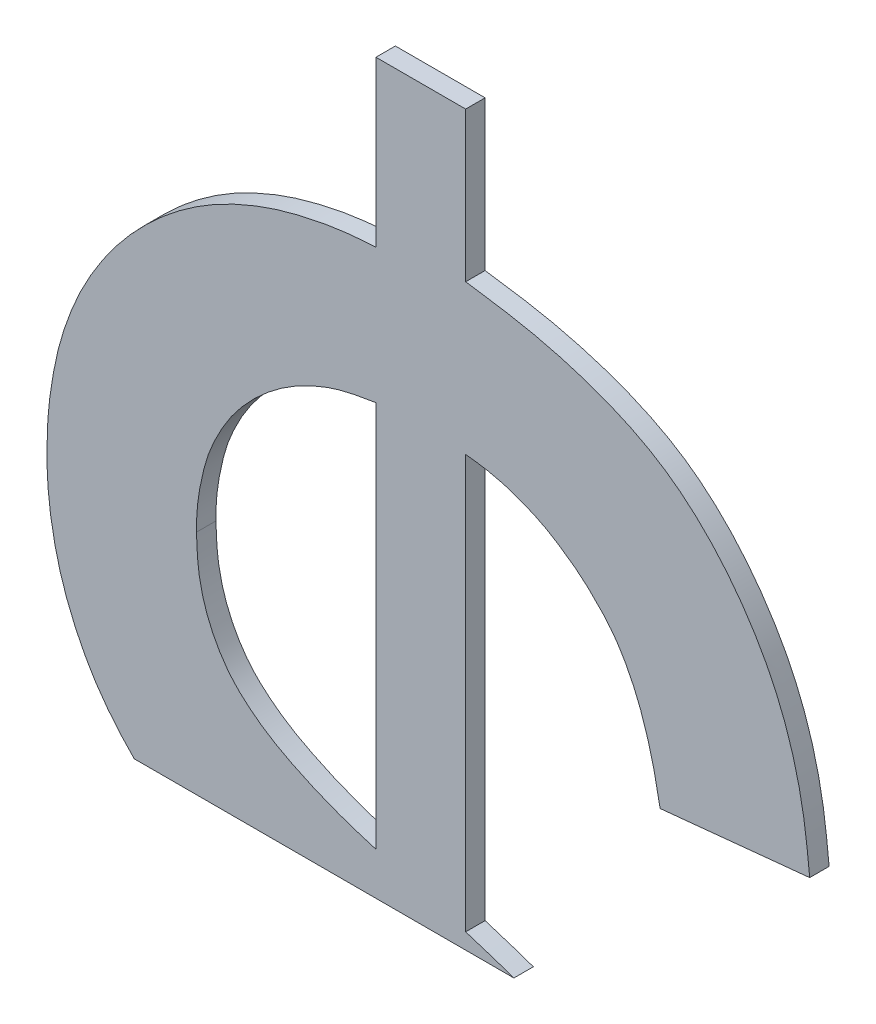
ISO-10303-21;
HEADER;
FILE_DESCRIPTION(('STEP AP214'),'2;1');
FILE_NAME('part.step','',(''),(''),'','','');
FILE_SCHEMA(('AUTOMOTIVE_DESIGN { 1 0 10303 214 1 1 1 1 }'));
ENDSEC;
DATA;
#1=APPLICATION_CONTEXT('core data for automotive mechanical design processes');
#2=APPLICATION_PROTOCOL_DEFINITION('international standard','automotive_design',2000,#1);
#3=PRODUCT_CONTEXT('',#1,'mechanical');
#4=PRODUCT('Part','Part','',(#3));
#5=PRODUCT_RELATED_PRODUCT_CATEGORY('part','',(#4));
#6=PRODUCT_DEFINITION_FORMATION('','',#4);
#7=PRODUCT_DEFINITION_CONTEXT('part definition',#1,'design');
#8=PRODUCT_DEFINITION('design','',#6,#7);
#9=PRODUCT_DEFINITION_SHAPE('','',#8);
#10=(LENGTH_UNIT() NAMED_UNIT(*) SI_UNIT(.MILLI.,.METRE.));
#11=(NAMED_UNIT(*) PLANE_ANGLE_UNIT() SI_UNIT($,.RADIAN.));
#12=(NAMED_UNIT(*) SI_UNIT($,.STERADIAN.) SOLID_ANGLE_UNIT());
#13=UNCERTAINTY_MEASURE_WITH_UNIT(LENGTH_MEASURE(1.E-05),#10,'distance_accuracy_value','');
#14=(GEOMETRIC_REPRESENTATION_CONTEXT(3) GLOBAL_UNCERTAINTY_ASSIGNED_CONTEXT((#13)) GLOBAL_UNIT_ASSIGNED_CONTEXT((#10,
#11,#12)) REPRESENTATION_CONTEXT('',''));
#15=CARTESIAN_POINT('',(0.,0.,0.));
#16=DIRECTION('',(0.,0.,1.));
#17=DIRECTION('',(1.,0.,0.));
#18=AXIS2_PLACEMENT_3D('',#15,#16,#17);
#19=CARTESIAN_POINT('',(1.15384615384615,0.907451923076922,0.5));
#20=CARTESIAN_POINT('',(1.53589483561115,0.787459078570648,0.5));
#21=CARTESIAN_POINT('',(2.30950065305638,0.544486999376421,0.5));
#22=CARTESIAN_POINT('',(3.4532438530345,0.0985681934332211,0.5));
#23=CARTESIAN_POINT('',(4.59457231407284,-0.421585353285468,0.5));
#24=CARTESIAN_POINT('',(5.34226271753068,-0.811849527559877,0.5));
#25=CARTESIAN_POINT('',(5.72115384615384,-1.00961538461539,0.5));
#26=B_SPLINE_CURVE_WITH_KNOTS('',3,(#19,#20,#21,#22,#23,#24,#25),.UNSPECIFIED.,.F.,.F.,(4,1,1,1,
4),(0.,0.242058272273776,0.490140907505919,0.741629575422577,1.),.UNSPECIFIED.);
#27=DIRECTION('',(0.,0.,1.));
#28=VECTOR('',#27,1.);
#29=SURFACE_OF_LINEAR_EXTRUSION('',#26,#28);
#30=CARTESIAN_POINT('',(1.15384615384615,0.907451923076922,1.));
#31=CARTESIAN_POINT('',(1.53589483561115,0.787459078570648,1.));
#32=CARTESIAN_POINT('',(2.30950065305638,0.544486999376421,1.));
#33=CARTESIAN_POINT('',(3.4532438530345,0.0985681934332211,1.));
#34=CARTESIAN_POINT('',(4.59457231407284,-0.421585353285468,1.));
#35=CARTESIAN_POINT('',(5.34226271753068,-0.811849527559877,1.));
#36=CARTESIAN_POINT('',(5.72115384615384,-1.00961538461539,1.));
#37=B_SPLINE_CURVE_WITH_KNOTS('',3,(#30,#31,#32,#33,#34,#35,#36),.UNSPECIFIED.,.F.,.F.,(4,1,1,1,
4),(0.,0.242058272273776,0.490140907505919,0.741629575422577,1.),.UNSPECIFIED.);
#38=CARTESIAN_POINT('',(1.15384615384615,0.907451923076922,1.));
#39=VERTEX_POINT('',#38);
#40=CARTESIAN_POINT('',(2.39404952686093,0.5,1.));
#41=VERTEX_POINT('',#40);
#42=EDGE_CURVE('E43',#39,#41,#37,.T.);
#43=ORIENTED_EDGE('',*,*,#42,.T.);
#44=DIRECTION('',(0.,0.,1.));
#45=VECTOR('',#44,1.);
#46=CARTESIAN_POINT('',(2.3940495441355,0.5,0.5));
#47=LINE('',#46,#45);
#48=CARTESIAN_POINT('',(2.39404952686093,0.5,0.499999999999815));
#49=VERTEX_POINT('',#48);
#50=EDGE_CURVE('E56',#41,#49,#47,.F.);
#51=ORIENTED_EDGE('',*,*,#50,.T.);
#52=CARTESIAN_POINT('',(1.15384615384615,0.907451923076922,0.5));
#53=VERTEX_POINT('',#52);
#54=EDGE_CURVE('E174',#53,#49,#26,.T.);
#55=ORIENTED_EDGE('',*,*,#54,.F.);
#56=DIRECTION('',(0.,0.,1.));
#57=VECTOR('',#56,1.);
#58=CARTESIAN_POINT('',(1.15384615384615,0.907451923076922,0.5));
#59=LINE('',#58,#57);
#60=EDGE_CURVE('E164',#53,#39,#59,.T.);
#61=ORIENTED_EDGE('',*,*,#60,.T.);
#62=EDGE_LOOP('',(#43,#51,#55,#61));
#63=FACE_BOUND('',#62,.T.);
#64=ADVANCED_FACE('F39',(#63),#29,.F.);
#65=CARTESIAN_POINT('',(-4.72355769230769,-1.20793269230769,0.5));
#66=CARTESIAN_POINT('',(-4.99055263360373,-1.08468379020655,0.5));
#67=CARTESIAN_POINT('',(-5.50975341105789,-0.845012860560219,0.5));
#68=CARTESIAN_POINT('',(-6.22622330699287,-0.412378697700305,0.5));
#69=CARTESIAN_POINT('',(-6.87464822067387,0.0476869164056274,0.5));
#70=CARTESIAN_POINT('',(-7.44668441314458,0.556318050159915,0.5));
#71=CARTESIAN_POINT('',(-7.94033959987234,1.11552185514443,0.5));
#72=CARTESIAN_POINT('',(-8.37960139666152,1.71453011685075,0.5));
#73=CARTESIAN_POINT('',(-8.75132379625515,2.36695925351341,0.5));
#74=CARTESIAN_POINT('',(-9.06283405278935,3.06337171504091,0.5));
#75=CARTESIAN_POINT('',(-9.31209001791492,3.79922497951258,0.5));
#76=CARTESIAN_POINT('',(-9.48148633531295,4.56937138693258,0.5));
#77=CARTESIAN_POINT('',(-9.59605696375953,5.36718351148169,0.5));
#78=CARTESIAN_POINT('',(-9.60888025027004,5.90904528303998,0.5));
#79=CARTESIAN_POINT('',(-9.61538461538462,6.18389423076923,0.5));
#80=B_SPLINE_CURVE_WITH_KNOTS('',3,(#65,#66,#67,#68,#69,#70,#71,#72,#73,#74,#75,#76,#77,#78,
#79),.UNSPECIFIED.,.F.,.F.,(4,1,1,1,1,1,1,1,1,1,1,1,4),(0.,0.0933920285341042,0.181610983292623,
0.265535446399889,0.345791528241057,0.424249841898664,0.502182062068234,0.581462596910971,
0.662392562061222,0.744330380200334,0.827884581179354,0.912697768630566,1.),.UNSPECIFIED.);
#81=DIRECTION('',(0.,0.,1.));
#82=VECTOR('',#81,1.);
#83=SURFACE_OF_LINEAR_EXTRUSION('',#80,#82);
#84=CARTESIAN_POINT('',(-7.3681851879955,0.50000000911951,0.5));
#85=VERTEX_POINT('',#84);
#86=CARTESIAN_POINT('',(-9.61538461538462,6.18389423076923,0.5));
#87=VERTEX_POINT('',#86);
#88=EDGE_CURVE('E162',#85,#87,#80,.T.);
#89=ORIENTED_EDGE('',*,*,#88,.F.);
#90=DIRECTION('',(0.,0.,1.));
#91=VECTOR('',#90,1.);
#92=CARTESIAN_POINT('',(-7.36818517862284,0.5,0.5));
#93=LINE('',#92,#91);
#94=CARTESIAN_POINT('',(-7.3681851879955,0.5,1.));
#95=VERTEX_POINT('',#94);
#96=EDGE_CURVE('E143',#85,#95,#93,.T.);
#97=ORIENTED_EDGE('',*,*,#96,.T.);
#98=CARTESIAN_POINT('',(-4.72355769230769,-1.20793269230769,1.));
#99=CARTESIAN_POINT('',(-4.99055263360373,-1.08468379020655,1.));
#100=CARTESIAN_POINT('',(-5.50975341105789,-0.845012860560219,1.));
#101=CARTESIAN_POINT('',(-6.22622330699287,-0.412378697700305,1.));
#102=CARTESIAN_POINT('',(-6.87464822067387,0.0476869164056274,1.));
#103=CARTESIAN_POINT('',(-7.44668441314458,0.556318050159915,1.));
#104=CARTESIAN_POINT('',(-7.94033959987234,1.11552185514443,1.));
#105=CARTESIAN_POINT('',(-8.37960139666152,1.71453011685075,1.));
#106=CARTESIAN_POINT('',(-8.75132379625515,2.36695925351341,1.));
#107=CARTESIAN_POINT('',(-9.06283405278935,3.06337171504091,1.));
#108=CARTESIAN_POINT('',(-9.31209001791492,3.79922497951258,1.));
#109=CARTESIAN_POINT('',(-9.48148633531295,4.56937138693258,1.));
#110=CARTESIAN_POINT('',(-9.59605696375953,5.36718351148169,1.));
#111=CARTESIAN_POINT('',(-9.60888025027004,5.90904528303998,1.));
#112=CARTESIAN_POINT('',(-9.61538461538462,6.18389423076923,1.));
#113=B_SPLINE_CURVE_WITH_KNOTS('',3,(#98,#99,#100,#101,#102,#103,#104,#105,#106,#107,#108,#109,
#110,#111,#112),.UNSPECIFIED.,.F.,.F.,(4,1,1,1,1,1,1,1,1,1,1,1,4),(0.,0.0933920285341042,
0.181610983292623,0.265535446399889,0.345791528241057,0.424249841898664,0.502182062068234,
0.581462596910971,0.662392562061222,0.744330380200334,0.827884581179354,0.912697768630566,1.),.UNSPECIFIED.);
#114=CARTESIAN_POINT('',(-9.61538461538462,6.18389423076923,1.));
#115=VERTEX_POINT('',#114);
#116=EDGE_CURVE('E159',#95,#115,#113,.T.);
#117=ORIENTED_EDGE('',*,*,#116,.T.);
#118=DIRECTION('',(0.,0.,1.));
#119=VECTOR('',#118,1.);
#120=CARTESIAN_POINT('',(-9.61538461538462,6.18389423076923,0.5));
#121=LINE('',#120,#119);
#122=EDGE_CURVE('E399',#87,#115,#121,.T.);
#123=ORIENTED_EDGE('',*,*,#122,.F.);
#124=EDGE_LOOP('',(#89,#97,#117,#123));
#125=FACE_BOUND('',#124,.T.);
#126=ADVANCED_FACE('F160',(#125),#83,.F.);
#127=CARTESIAN_POINT('',(7.41139186249124,12.7931073927375,0.5));
#128=DIRECTION('',(0.,0.,1.));
#129=DIRECTION('',(0.,-1.,0.));
#130=AXIS2_PLACEMENT_3D('',#127,#128,#129);
#131=PLANE('',#130);
#132=CARTESIAN_POINT('',(-5.76923076923077,6.34615384615384,0.5));
#133=CARTESIAN_POINT('',(-5.75932804599917,6.06059324925486,0.5));
#134=CARTESIAN_POINT('',(-5.74033115243513,5.51278794979304,0.5));
#135=CARTESIAN_POINT('',(-5.5499116651548,4.73321644594742,0.5));
#136=CARTESIAN_POINT('',(-5.2342438350835,4.04372300357638,0.5));
#137=CARTESIAN_POINT('',(-4.86857017978813,3.53534728070128,0.5));
#138=CARTESIAN_POINT('',(-4.49662450325635,3.18582118569488,0.5));
#139=CARTESIAN_POINT('',(-4.16939979307783,2.92603971811161,0.5));
#140=CARTESIAN_POINT('',(-3.79286511348281,2.67429430266833,0.5));
#141=CARTESIAN_POINT('',(-3.36112567089013,2.44255506867912,0.5));
#142=CARTESIAN_POINT('',(-2.88436336618781,2.21283090756656,0.5));
#143=CARTESIAN_POINT('',(-2.35537745167494,1.99077937747943,0.5));
#144=CARTESIAN_POINT('',(-1.77327211848351,1.78149018071147,0.5));
#145=CARTESIAN_POINT('',(-1.36475589580147,1.65688139943376,0.5));
#146=CARTESIAN_POINT('',(-1.15384615384616,1.59254807692308,0.5));
#147=B_SPLINE_CURVE_WITH_KNOTS('',3,(#132,#133,#134,#135,#136,#137,#138,#139,#140,#141,#142,
#143,#144,#145,#146),.UNSPECIFIED.,.F.,.F.,(4,1,1,1,1,1,1,1,1,1,1,1,4),(0.,0.118154276653069,
0.226661309744796,0.329907520162531,0.430842471579163,0.483677455027972,0.540972664276143,
0.603818691361891,0.671055171585721,0.743817869451624,0.823052957069743,0.908645353373829,1.),.UNSPECIFIED.);
#148=CARTESIAN_POINT('',(-5.76923076923077,6.34615384615384,0.5));
#149=VERTEX_POINT('',#148);
#150=CARTESIAN_POINT('',(-1.15384615384616,1.59254807692308,0.5));
#151=VERTEX_POINT('',#150);
#152=EDGE_CURVE('E167',#149,#151,#147,.T.);
#153=ORIENTED_EDGE('',*,*,#152,.T.);
#154=DIRECTION('',(0.,1.,0.));
#155=VECTOR('',#154,1.);
#156=CARTESIAN_POINT('',(-1.15384615384616,1.59254807692308,0.5));
#157=LINE('',#156,#155);
#158=CARTESIAN_POINT('',(-1.15384615384616,11.5384615384615,0.5));
#159=VERTEX_POINT('',#158);
#160=EDGE_CURVE('E170',#151,#159,#157,.T.);
#161=ORIENTED_EDGE('',*,*,#160,.T.);
#162=CARTESIAN_POINT('',(-1.15384615384616,11.5384615384615,0.5));
#163=CARTESIAN_POINT('',(-1.4753083425477,11.4861317803194,0.5));
#164=CARTESIAN_POINT('',(-2.10557346527877,11.383533021905,0.5));
#165=CARTESIAN_POINT('',(-2.99155934078027,11.0293207097073,0.5));
#166=CARTESIAN_POINT('',(-3.78953621769737,10.5308144611791,0.5));
#167=CARTESIAN_POINT('',(-4.37005840677036,9.99748361050959,0.5));
#168=CARTESIAN_POINT('',(-4.77698241366401,9.51391347896452,0.5));
#169=CARTESIAN_POINT('',(-5.04175876781717,9.12244174090144,0.5));
#170=CARTESIAN_POINT('',(-5.26341587648575,8.71036265715648,0.5));
#171=CARTESIAN_POINT('',(-5.45519661853269,8.28308982526634,0.5));
#172=CARTESIAN_POINT('',(-5.59021391689391,7.82730967002522,0.5));
#173=CARTESIAN_POINT('',(-5.69106762656066,7.35309163588154,0.5));
#174=CARTESIAN_POINT('',(-5.76278062428456,6.85711385447647,0.5));
#175=CARTESIAN_POINT('',(-5.76705272906671,6.51869127432626,0.5));
#176=CARTESIAN_POINT('',(-5.76923076923077,6.34615384615384,0.5));
#177=B_SPLINE_CURVE_WITH_KNOTS('',3,(#162,#163,#164,#165,#166,#167,#168,#169,#170,#171,#172,
#173,#174,#175,#176),.UNSPECIFIED.,.F.,.F.,(4,1,1,1,1,1,1,1,1,1,1,1,4),(0.,0.127646236634752,
0.250265735213593,0.371898753809236,0.495569504274189,0.55814670152969,0.619921945102661,
0.680849114374849,0.741822015234598,0.803562154960515,0.867160447008884,0.93227462889005,1.),.UNSPECIFIED.);
#178=EDGE_CURVE('E182',#159,#149,#177,.T.);
#179=ORIENTED_EDGE('',*,*,#178,.T.);
#180=EDGE_LOOP('',(#153,#161,#179));
#181=FACE_BOUND('',#180,.T.);
#182=ORIENTED_EDGE('',*,*,#54,.T.);
#183=DIRECTION('',(-1.,0.,0.));
#184=VECTOR('',#183,1.);
#185=CARTESIAN_POINT('',(7.41139186249124,0.5,0.499999999999828));
#186=LINE('',#185,#184);
#187=EDGE_CURVE('E183',#49,#85,#186,.T.);
#188=ORIENTED_EDGE('',*,*,#187,.T.);
#189=ORIENTED_EDGE('',*,*,#88,.T.);
#190=CARTESIAN_POINT('',(-9.61538461538462,6.18389423076923,0.5));
#191=CARTESIAN_POINT('',(-9.60955517472747,6.48682762412066,0.5));
#192=CARTESIAN_POINT('',(-9.5981227716309,7.08092521733586,0.5));
#193=CARTESIAN_POINT('',(-9.47579034685065,7.95046230217413,0.499999999999999));
#194=CARTESIAN_POINT('',(-9.30229914045198,8.78372096506586,0.5));
#195=CARTESIAN_POINT('',(-9.03885026627769,9.57529791808696,0.5));
#196=CARTESIAN_POINT('',(-8.70926808867929,10.332337058475,0.5));
#197=CARTESIAN_POINT('',(-8.29749455743344,11.046234761017,0.5));
#198=CARTESIAN_POINT('',(-7.82001700107709,11.7269795660214,0.5));
#199=CARTESIAN_POINT('',(-7.26838995195899,12.3593215380845,0.5));
#200=CARTESIAN_POINT('',(-6.65954557347659,12.9398464421824,0.5));
#201=CARTESIAN_POINT('',(-6.00140994880213,13.4533425710483,0.5));
#202=CARTESIAN_POINT('',(-5.29980160883602,13.896517603714,0.5));
#203=CARTESIAN_POINT('',(-4.55297699960888,14.2609991086634,0.5));
#204=CARTESIAN_POINT('',(-3.7650372238874,14.5601861634961,0.5));
#205=CARTESIAN_POINT('',(-2.93234770740791,14.7774933403931,0.5));
#206=CARTESIAN_POINT('',(-2.05899968358638,14.9411498002707,0.5));
#207=CARTESIAN_POINT('',(-1.45906006635459,14.9801559634679,0.5));
#208=CARTESIAN_POINT('',(-1.15384615384616,15.,0.5));
#209=B_SPLINE_CURVE_WITH_KNOTS('',3,(#190,#191,#192,#193,#194,#195,#196,#197,#198,#199,#200,
#201,#202,#203,#204,#205,#206,#207,#208),.UNSPECIFIED.,.F.,.F.,(4,1,1,1,1,1,1,1,1,1,1,1,1,1,1,1,
4),(0.,0.0667956946960947,0.130996325684209,0.193417951762092,0.254360414925997,
0.314723074031424,0.375303809955522,0.435884545879619,0.497923155798862,0.560139439289635,
0.621235587589443,0.681816323513541,0.742898080258227,0.804305217370024,0.867456527214562,
0.932569694108617,1.),.UNSPECIFIED.);
#210=CARTESIAN_POINT('',(-1.15384615384616,15.,0.5));
#211=VERTEX_POINT('',#210);
#212=EDGE_CURVE('E231',#87,#211,#209,.T.);
#213=ORIENTED_EDGE('',*,*,#212,.T.);
#214=DIRECTION('',(0.,1.,0.));
#215=VECTOR('',#214,1.);
#216=CARTESIAN_POINT('',(-1.15384615384616,15.,0.5));
#217=LINE('',#216,#215);
#218=CARTESIAN_POINT('',(-1.15384615384616,19.2307692307692,0.5));
#219=VERTEX_POINT('',#218);
#220=EDGE_CURVE('E235',#211,#219,#217,.T.);
#221=ORIENTED_EDGE('',*,*,#220,.T.);
#222=DIRECTION('',(1.,0.,0.));
#223=VECTOR('',#222,1.);
#224=CARTESIAN_POINT('',(-1.15384615384616,19.2307692307692,0.5));
#225=LINE('',#224,#223);
#226=CARTESIAN_POINT('',(1.15384615384615,19.2307692307692,0.5));
#227=VERTEX_POINT('',#226);
#228=EDGE_CURVE('E237',#219,#227,#225,.T.);
#229=ORIENTED_EDGE('',*,*,#228,.T.);
#230=DIRECTION('',(0.,-1.,0.));
#231=VECTOR('',#230,1.);
#232=CARTESIAN_POINT('',(1.15384615384615,19.2307692307692,0.5));
#233=LINE('',#232,#231);
#234=CARTESIAN_POINT('',(1.15384615384615,15.3846153846154,0.5));
#235=VERTEX_POINT('',#234);
#236=EDGE_CURVE('E291',#227,#235,#233,.T.);
#237=ORIENTED_EDGE('',*,*,#236,.T.);
#238=CARTESIAN_POINT('',(1.15384615384615,15.3846153846154,0.5));
#239=CARTESIAN_POINT('',(1.58962502328593,15.322850324043,0.5));
#240=CARTESIAN_POINT('',(2.42245030189539,15.204809943045,0.5));
#241=CARTESIAN_POINT('',(3.60149309312993,14.9354514002694,0.5));
#242=CARTESIAN_POINT('',(4.65215070614306,14.5946429315111,0.5));
#243=CARTESIAN_POINT('',(5.59406936752121,14.1832671756058,0.5));
#244=CARTESIAN_POINT('',(6.44831743485881,13.6692050285473,0.5));
#245=CARTESIAN_POINT('',(7.22068051374382,13.0155873297722,0.5));
#246=CARTESIAN_POINT('',(7.93469071830127,12.2313624307633,0.5));
#247=CARTESIAN_POINT('',(8.58009694369757,11.318559382939,0.5));
#248=CARTESIAN_POINT('',(9.14204263349455,10.2888041178539,0.5));
#249=CARTESIAN_POINT('',(9.56989400136833,9.13572016103952,0.5));
#250=CARTESIAN_POINT('',(9.86415372256355,7.87500939236058,0.5));
#251=CARTESIAN_POINT('',(9.95383535776246,6.99266061312857,0.5));
#252=CARTESIAN_POINT('',(10.,6.53846153846154,0.5));
#253=B_SPLINE_CURVE_WITH_KNOTS('',3,(#238,#239,#240,#241,#242,#243,#244,#245,#246,#247,#248,
#249,#250,#251,#252),.UNSPECIFIED.,.F.,.F.,(4,1,1,1,1,1,1,1,1,1,1,1,4),(0.,0.0955070898349489,
0.182525414330493,0.262140221931509,0.334942378642965,0.405189690581994,0.477731680801076,
0.553750594048482,0.634827900313816,0.719849377267761,0.807637790442588,0.900979363673025,1.),.UNSPECIFIED.);
#254=CARTESIAN_POINT('',(10.,6.53846153846154,0.5));
#255=VERTEX_POINT('',#254);
#256=EDGE_CURVE('E293',#235,#255,#253,.T.);
#257=ORIENTED_EDGE('',*,*,#256,.T.);
#258=DIRECTION('',(-0.995037190209989,-0.0995037190209988,0.));
#259=VECTOR('',#258,1.);
#260=CARTESIAN_POINT('',(10.,6.53846153846154,0.5));
#261=LINE('',#260,#259);
#262=CARTESIAN_POINT('',(6.15384615384615,6.15384615384615,0.5));
#263=VERTEX_POINT('',#262);
#264=EDGE_CURVE('E298',#255,#263,#261,.T.);
#265=ORIENTED_EDGE('',*,*,#264,.T.);
#266=CARTESIAN_POINT('',(6.15384615384615,6.15384615384615,0.5));
#267=CARTESIAN_POINT('',(6.11745649090548,6.35049280694764,0.5));
#268=CARTESIAN_POINT('',(6.04658404020097,6.73348152137632,0.5));
#269=CARTESIAN_POINT('',(5.91617266376332,7.28362623071087,0.5));
#270=CARTESIAN_POINT('',(5.76386970333949,7.79253472381393,0.5));
#271=CARTESIAN_POINT('',(5.599559473583,8.26270205715665,0.5));
#272=CARTESIAN_POINT('',(5.40423860866502,8.69064756795266,0.5));
#273=CARTESIAN_POINT('',(5.19759122246891,9.0806492580052,0.5));
#274=CARTESIAN_POINT('',(4.96772831034702,9.43052061482849,0.5));
#275=CARTESIAN_POINT('',(4.79186696440108,9.63512672690789,0.5));
#276=CARTESIAN_POINT('',(4.70552884615384,9.73557692307693,0.5));
#277=B_SPLINE_CURVE_WITH_KNOTS('',3,(#266,#267,#268,#269,#270,#271,#272,#273,#274,#275,#276),
.UNSPECIFIED.,.F.,.F.,(4,1,1,1,1,1,1,1,4),(0.,0.15329150044996,0.298550286843047,
0.433132698451492,0.560393474398824,0.679983463495146,0.793348119576434,0.898545445606283,1.),.UNSPECIFIED.);
#278=CARTESIAN_POINT('',(4.70552884615384,9.73557692307693,0.5));
#279=VERTEX_POINT('',#278);
#280=EDGE_CURVE('E321',#263,#279,#277,.T.);
#281=ORIENTED_EDGE('',*,*,#280,.T.);
#282=CARTESIAN_POINT('',(4.70552884615384,9.73557692307692,0.5));
#283=CARTESIAN_POINT('',(4.5819349288881,9.8664857604465,0.5));
#284=CARTESIAN_POINT('',(4.33816581664662,10.1246823754266,0.5));
#285=CARTESIAN_POINT('',(3.93383900529747,10.4588769265589,0.5));
#286=CARTESIAN_POINT('',(3.51372648086241,10.7485924867606,0.5));
#287=CARTESIAN_POINT('',(3.08343550687438,11.0083515868184,0.5));
#288=CARTESIAN_POINT('',(2.62210149600414,11.1994549051335,0.5));
#289=CARTESIAN_POINT('',(2.15127724489674,11.3684402779212,0.5));
#290=CARTESIAN_POINT('',(1.65901873526613,11.4823144857725,0.5));
#291=CARTESIAN_POINT('',(1.3225987093175,11.5197056538947,0.5));
#292=CARTESIAN_POINT('',(1.15384615384615,11.5384615384615,0.5));
#293=B_SPLINE_CURVE_WITH_KNOTS('',3,(#282,#283,#284,#285,#286,#287,#288,#289,#290,#291,#292),
.UNSPECIFIED.,.F.,.F.,(4,1,1,1,1,1,1,1,4),(0.,0.132296135514945,0.260932837318478,
0.384755761345875,0.507549119686902,0.629606836866915,0.751201402836805,0.87519946545814,1.),.UNSPECIFIED.);
#294=CARTESIAN_POINT('',(1.15384615384615,11.5384615384615,0.5));
#295=VERTEX_POINT('',#294);
#296=EDGE_CURVE('E324',#279,#295,#293,.T.);
#297=ORIENTED_EDGE('',*,*,#296,.T.);
#298=DIRECTION('',(0.,-1.,0.));
#299=VECTOR('',#298,1.);
#300=CARTESIAN_POINT('',(1.15384615384615,11.5384615384615,0.5));
#301=LINE('',#300,#299);
#302=EDGE_CURVE('E155',#295,#53,#301,.T.);
#303=ORIENTED_EDGE('',*,*,#302,.T.);
#304=EDGE_LOOP('',(#182,#188,#189,#213,#221,#229,#237,#257,#265,#281,#297,#303));
#305=FACE_BOUND('',#304,.T.);
#306=ADVANCED_FACE('F197',(#181,#305),#131,.F.);
#307=CARTESIAN_POINT('',(7.41139186249124,12.7931073927375,1.));
#308=DIRECTION('',(0.,0.,1.));
#309=DIRECTION('',(0.,-1.,0.));
#310=AXIS2_PLACEMENT_3D('',#307,#308,#309);
#311=PLANE('',#310);
#312=DIRECTION('',(0.,1.,0.));
#313=VECTOR('',#312,1.);
#314=CARTESIAN_POINT('',(-1.15384615384616,1.59254807692308,1.));
#315=LINE('',#314,#313);
#316=CARTESIAN_POINT('',(-1.15384615384616,1.59254807692308,1.));
#317=VERTEX_POINT('',#316);
#318=CARTESIAN_POINT('',(-1.15384615384616,11.5384615384615,1.));
#319=VERTEX_POINT('',#318);
#320=EDGE_CURVE('E215',#317,#319,#315,.T.);
#321=ORIENTED_EDGE('',*,*,#320,.F.);
#322=CARTESIAN_POINT('',(-5.76923076923077,6.34615384615384,1.));
#323=CARTESIAN_POINT('',(-5.75932804599917,6.06059324925486,1.));
#324=CARTESIAN_POINT('',(-5.74033115243513,5.51278794979304,1.));
#325=CARTESIAN_POINT('',(-5.5499116651548,4.73321644594742,1.));
#326=CARTESIAN_POINT('',(-5.2342438350835,4.04372300357638,1.));
#327=CARTESIAN_POINT('',(-4.86857017978813,3.53534728070128,1.));
#328=CARTESIAN_POINT('',(-4.49662450325635,3.18582118569488,1.));
#329=CARTESIAN_POINT('',(-4.16939979307783,2.92603971811161,1.));
#330=CARTESIAN_POINT('',(-3.79286511348281,2.67429430266833,1.));
#331=CARTESIAN_POINT('',(-3.36112567089013,2.44255506867912,1.));
#332=CARTESIAN_POINT('',(-2.88436336618781,2.21283090756656,1.));
#333=CARTESIAN_POINT('',(-2.35537745167494,1.99077937747943,1.));
#334=CARTESIAN_POINT('',(-1.77327211848351,1.78149018071147,1.));
#335=CARTESIAN_POINT('',(-1.36475589580147,1.65688139943376,1.));
#336=CARTESIAN_POINT('',(-1.15384615384616,1.59254807692308,1.));
#337=B_SPLINE_CURVE_WITH_KNOTS('',3,(#322,#323,#324,#325,#326,#327,#328,#329,#330,#331,#332,
#333,#334,#335,#336),.UNSPECIFIED.,.F.,.F.,(4,1,1,1,1,1,1,1,1,1,1,1,4),(0.,0.118154276653069,
0.226661309744796,0.329907520162531,0.430842471579163,0.483677455027972,0.540972664276143,
0.603818691361891,0.671055171585721,0.743817869451624,0.823052957069743,0.908645353373829,1.),.UNSPECIFIED.);
#338=CARTESIAN_POINT('',(-5.76923076923077,6.34615384615384,1.));
#339=VERTEX_POINT('',#338);
#340=EDGE_CURVE('E274',#339,#317,#337,.T.);
#341=ORIENTED_EDGE('',*,*,#340,.F.);
#342=CARTESIAN_POINT('',(-1.15384615384616,11.5384615384615,1.));
#343=CARTESIAN_POINT('',(-1.4753083425477,11.4861317803194,1.));
#344=CARTESIAN_POINT('',(-2.10557346527877,11.383533021905,1.));
#345=CARTESIAN_POINT('',(-2.99155934078027,11.0293207097073,1.));
#346=CARTESIAN_POINT('',(-3.78953621769737,10.5308144611791,1.));
#347=CARTESIAN_POINT('',(-4.37005840677036,9.99748361050959,1.));
#348=CARTESIAN_POINT('',(-4.77698241366401,9.51391347896452,1.));
#349=CARTESIAN_POINT('',(-5.04175876781717,9.12244174090144,1.));
#350=CARTESIAN_POINT('',(-5.26341587648575,8.71036265715648,1.));
#351=CARTESIAN_POINT('',(-5.45519661853269,8.28308982526634,1.));
#352=CARTESIAN_POINT('',(-5.59021391689391,7.82730967002522,1.));
#353=CARTESIAN_POINT('',(-5.69106762656066,7.35309163588154,1.));
#354=CARTESIAN_POINT('',(-5.76278062428456,6.85711385447647,1.));
#355=CARTESIAN_POINT('',(-5.76705272906671,6.51869127432626,1.));
#356=CARTESIAN_POINT('',(-5.76923076923077,6.34615384615384,1.));
#357=B_SPLINE_CURVE_WITH_KNOTS('',3,(#342,#343,#344,#345,#346,#347,#348,#349,#350,#351,#352,
#353,#354,#355,#356),.UNSPECIFIED.,.F.,.F.,(4,1,1,1,1,1,1,1,1,1,1,1,4),(0.,0.127646236634752,
0.250265735213593,0.371898753809236,0.495569504274189,0.55814670152969,0.619921945102661,
0.680849114374849,0.741822015234598,0.803562154960515,0.867160447008884,0.93227462889005,1.),.UNSPECIFIED.);
#358=EDGE_CURVE('E51',#319,#339,#357,.T.);
#359=ORIENTED_EDGE('',*,*,#358,.F.);
#360=EDGE_LOOP('',(#321,#341,#359));
#361=FACE_BOUND('',#360,.T.);
#362=ORIENTED_EDGE('',*,*,#116,.F.);
#363=DIRECTION('',(1.,0.,0.));
#364=VECTOR('',#363,1.);
#365=CARTESIAN_POINT('',(-17.,0.5,1.));
#366=LINE('',#365,#364);
#367=EDGE_CURVE('E147',#95,#41,#366,.T.);
#368=ORIENTED_EDGE('',*,*,#367,.T.);
#369=ORIENTED_EDGE('',*,*,#42,.F.);
#370=DIRECTION('',(0.,-1.,0.));
#371=VECTOR('',#370,1.);
#372=CARTESIAN_POINT('',(1.15384615384615,11.5384615384615,1.));
#373=LINE('',#372,#371);
#374=CARTESIAN_POINT('',(1.15384615384615,11.5384615384615,1.));
#375=VERTEX_POINT('',#374);
#376=EDGE_CURVE('E341',#375,#39,#373,.T.);
#377=ORIENTED_EDGE('',*,*,#376,.F.);
#378=CARTESIAN_POINT('',(4.70552884615384,9.73557692307692,1.));
#379=CARTESIAN_POINT('',(4.5819349288881,9.8664857604465,1.));
#380=CARTESIAN_POINT('',(4.33816581664662,10.1246823754266,1.));
#381=CARTESIAN_POINT('',(3.93383900529747,10.4588769265589,1.));
#382=CARTESIAN_POINT('',(3.51372648086241,10.7485924867606,1.));
#383=CARTESIAN_POINT('',(3.08343550687438,11.0083515868184,1.));
#384=CARTESIAN_POINT('',(2.62210149600414,11.1994549051335,1.));
#385=CARTESIAN_POINT('',(2.15127724489674,11.3684402779212,1.));
#386=CARTESIAN_POINT('',(1.65901873526613,11.4823144857725,1.));
#387=CARTESIAN_POINT('',(1.3225987093175,11.5197056538947,1.));
#388=CARTESIAN_POINT('',(1.15384615384615,11.5384615384615,1.));
#389=B_SPLINE_CURVE_WITH_KNOTS('',3,(#378,#379,#380,#381,#382,#383,#384,#385,#386,#387,#388),
.UNSPECIFIED.,.F.,.F.,(4,1,1,1,1,1,1,1,4),(0.,0.132296135514945,0.260932837318478,
0.384755761345875,0.507549119686902,0.629606836866915,0.751201402836805,0.87519946545814,1.),.UNSPECIFIED.);
#390=CARTESIAN_POINT('',(4.70552884615384,9.73557692307693,1.));
#391=VERTEX_POINT('',#390);
#392=EDGE_CURVE('E346',#391,#375,#389,.T.);
#393=ORIENTED_EDGE('',*,*,#392,.F.);
#394=CARTESIAN_POINT('',(6.15384615384615,6.15384615384615,1.));
#395=CARTESIAN_POINT('',(6.11745649090548,6.35049280694764,1.));
#396=CARTESIAN_POINT('',(6.04658404020097,6.73348152137632,1.));
#397=CARTESIAN_POINT('',(5.91617266376332,7.28362623071087,1.));
#398=CARTESIAN_POINT('',(5.76386970333949,7.79253472381393,1.));
#399=CARTESIAN_POINT('',(5.599559473583,8.26270205715665,1.));
#400=CARTESIAN_POINT('',(5.40423860866502,8.69064756795266,1.));
#401=CARTESIAN_POINT('',(5.19759122246891,9.0806492580052,1.));
#402=CARTESIAN_POINT('',(4.96772831034702,9.43052061482849,1.));
#403=CARTESIAN_POINT('',(4.79186696440108,9.63512672690789,1.));
#404=CARTESIAN_POINT('',(4.70552884615384,9.73557692307693,1.));
#405=B_SPLINE_CURVE_WITH_KNOTS('',3,(#394,#395,#396,#397,#398,#399,#400,#401,#402,#403,#404),
.UNSPECIFIED.,.F.,.F.,(4,1,1,1,1,1,1,1,4),(0.,0.15329150044996,0.298550286843047,
0.433132698451492,0.560393474398824,0.679983463495146,0.793348119576434,0.898545445606283,1.),.UNSPECIFIED.);
#406=CARTESIAN_POINT('',(6.15384615384615,6.15384615384615,1.));
#407=VERTEX_POINT('',#406);
#408=EDGE_CURVE('E362',#407,#391,#405,.T.);
#409=ORIENTED_EDGE('',*,*,#408,.F.);
#410=DIRECTION('',(-0.995037190209989,-0.0995037190209988,0.));
#411=VECTOR('',#410,1.);
#412=CARTESIAN_POINT('',(10.,6.53846153846154,1.));
#413=LINE('',#412,#411);
#414=CARTESIAN_POINT('',(10.,6.53846153846154,1.));
#415=VERTEX_POINT('',#414);
#416=EDGE_CURVE('E375',#415,#407,#413,.T.);
#417=ORIENTED_EDGE('',*,*,#416,.F.);
#418=CARTESIAN_POINT('',(1.15384615384615,15.3846153846154,1.));
#419=CARTESIAN_POINT('',(1.58962502328593,15.322850324043,1.));
#420=CARTESIAN_POINT('',(2.42245030189539,15.204809943045,1.));
#421=CARTESIAN_POINT('',(3.60149309312993,14.9354514002694,1.));
#422=CARTESIAN_POINT('',(4.65215070614306,14.5946429315111,1.));
#423=CARTESIAN_POINT('',(5.59406936752121,14.1832671756058,1.));
#424=CARTESIAN_POINT('',(6.44831743485881,13.6692050285473,1.));
#425=CARTESIAN_POINT('',(7.22068051374382,13.0155873297722,1.));
#426=CARTESIAN_POINT('',(7.93469071830127,12.2313624307633,1.));
#427=CARTESIAN_POINT('',(8.58009694369757,11.318559382939,1.));
#428=CARTESIAN_POINT('',(9.14204263349455,10.2888041178539,1.));
#429=CARTESIAN_POINT('',(9.56989400136833,9.13572016103952,1.));
#430=CARTESIAN_POINT('',(9.86415372256355,7.87500939236058,1.));
#431=CARTESIAN_POINT('',(9.95383535776246,6.99266061312857,1.));
#432=CARTESIAN_POINT('',(10.,6.53846153846154,1.));
#433=B_SPLINE_CURVE_WITH_KNOTS('',3,(#418,#419,#420,#421,#422,#423,#424,#425,#426,#427,#428,
#429,#430,#431,#432),.UNSPECIFIED.,.F.,.F.,(4,1,1,1,1,1,1,1,1,1,1,1,4),(0.,0.0955070898349489,
0.182525414330493,0.262140221931509,0.334942378642965,0.405189690581994,0.477731680801076,
0.553750594048482,0.634827900313816,0.719849377267761,0.807637790442588,0.900979363673025,1.),.UNSPECIFIED.);
#434=CARTESIAN_POINT('',(1.15384615384615,15.3846153846154,1.));
#435=VERTEX_POINT('',#434);
#436=EDGE_CURVE('E380',#435,#415,#433,.T.);
#437=ORIENTED_EDGE('',*,*,#436,.F.);
#438=DIRECTION('',(0.,-1.,0.));
#439=VECTOR('',#438,1.);
#440=CARTESIAN_POINT('',(1.15384615384615,19.2307692307692,1.));
#441=LINE('',#440,#439);
#442=CARTESIAN_POINT('',(1.15384615384615,19.2307692307692,1.));
#443=VERTEX_POINT('',#442);
#444=EDGE_CURVE('E381',#443,#435,#441,.T.);
#445=ORIENTED_EDGE('',*,*,#444,.F.);
#446=DIRECTION('',(1.,0.,0.));
#447=VECTOR('',#446,1.);
#448=CARTESIAN_POINT('',(-1.15384615384616,19.2307692307692,1.));
#449=LINE('',#448,#447);
#450=CARTESIAN_POINT('',(-1.15384615384616,19.2307692307692,1.));
#451=VERTEX_POINT('',#450);
#452=EDGE_CURVE('E154',#451,#443,#449,.T.);
#453=ORIENTED_EDGE('',*,*,#452,.F.);
#454=DIRECTION('',(0.,1.,0.));
#455=VECTOR('',#454,1.);
#456=CARTESIAN_POINT('',(-1.15384615384616,15.,1.));
#457=LINE('',#456,#455);
#458=CARTESIAN_POINT('',(-1.15384615384616,15.,1.));
#459=VERTEX_POINT('',#458);
#460=EDGE_CURVE('E396',#459,#451,#457,.T.);
#461=ORIENTED_EDGE('',*,*,#460,.F.);
#462=CARTESIAN_POINT('',(-9.61538461538462,6.18389423076923,1.));
#463=CARTESIAN_POINT('',(-9.60955517472747,6.48682762412066,1.));
#464=CARTESIAN_POINT('',(-9.5981227716309,7.08092521733586,1.));
#465=CARTESIAN_POINT('',(-9.47579034685065,7.95046230217413,0.999999999999999));
#466=CARTESIAN_POINT('',(-9.30229914045198,8.78372096506586,1.));
#467=CARTESIAN_POINT('',(-9.03885026627769,9.57529791808696,1.));
#468=CARTESIAN_POINT('',(-8.70926808867929,10.332337058475,1.));
#469=CARTESIAN_POINT('',(-8.29749455743344,11.046234761017,1.));
#470=CARTESIAN_POINT('',(-7.82001700107709,11.7269795660214,1.));
#471=CARTESIAN_POINT('',(-7.26838995195899,12.3593215380845,1.));
#472=CARTESIAN_POINT('',(-6.65954557347659,12.9398464421824,1.));
#473=CARTESIAN_POINT('',(-6.00140994880213,13.4533425710483,1.));
#474=CARTESIAN_POINT('',(-5.29980160883602,13.896517603714,1.));
#475=CARTESIAN_POINT('',(-4.55297699960888,14.2609991086634,1.));
#476=CARTESIAN_POINT('',(-3.7650372238874,14.5601861634961,1.));
#477=CARTESIAN_POINT('',(-2.93234770740791,14.7774933403931,1.));
#478=CARTESIAN_POINT('',(-2.05899968358638,14.9411498002707,1.));
#479=CARTESIAN_POINT('',(-1.45906006635459,14.9801559634679,1.));
#480=CARTESIAN_POINT('',(-1.15384615384616,15.,1.));
#481=B_SPLINE_CURVE_WITH_KNOTS('',3,(#462,#463,#464,#465,#466,#467,#468,#469,#470,#471,#472,
#473,#474,#475,#476,#477,#478,#479,#480),.UNSPECIFIED.,.F.,.F.,(4,1,1,1,1,1,1,1,1,1,1,1,1,1,1,1,
4),(0.,0.0667956946960947,0.130996325684209,0.193417951762092,0.254360414925997,
0.314723074031424,0.375303809955522,0.435884545879619,0.497923155798862,0.560139439289635,
0.621235587589443,0.681816323513541,0.742898080258227,0.804305217370024,0.867456527214562,
0.932569694108617,1.),.UNSPECIFIED.);
#482=EDGE_CURVE('E168',#115,#459,#481,.T.);
#483=ORIENTED_EDGE('',*,*,#482,.F.);
#484=EDGE_LOOP('',(#362,#368,#369,#377,#393,#409,#417,#437,#445,#453,#461,#483));
#485=FACE_BOUND('',#484,.T.);
#486=ADVANCED_FACE('F41',(#361,#485),#311,.T.);
#487=CARTESIAN_POINT('',(-1.15384615384616,19.2307692307692,0.5));
#488=DIRECTION('',(0.,-1.,0.));
#489=DIRECTION('',(0.,0.,-1.));
#490=AXIS2_PLACEMENT_3D('',#487,#488,#489);
#491=PLANE('',#490);
#492=ORIENTED_EDGE('',*,*,#452,.T.);
#493=DIRECTION('',(0.,0.,1.));
#494=VECTOR('',#493,1.);
#495=CARTESIAN_POINT('',(1.15384615384615,19.2307692307692,0.5));
#496=LINE('',#495,#494);
#497=EDGE_CURVE('E385',#227,#443,#496,.T.);
#498=ORIENTED_EDGE('',*,*,#497,.F.);
#499=ORIENTED_EDGE('',*,*,#228,.F.);
#500=DIRECTION('',(0.,0.,1.));
#501=VECTOR('',#500,1.);
#502=CARTESIAN_POINT('',(-1.15384615384616,19.2307692307692,0.5));
#503=LINE('',#502,#501);
#504=EDGE_CURVE('E389',#219,#451,#503,.T.);
#505=ORIENTED_EDGE('',*,*,#504,.T.);
#506=EDGE_LOOP('',(#492,#498,#499,#505));
#507=FACE_BOUND('',#506,.T.);
#508=ADVANCED_FACE('F411',(#507),#491,.F.);
#509=CARTESIAN_POINT('',(1.15384615384615,19.2307692307692,0.5));
#510=DIRECTION('',(-1.,0.,0.));
#511=DIRECTION('',(0.,0.,1.));
#512=AXIS2_PLACEMENT_3D('',#509,#510,#511);
#513=PLANE('',#512);
#514=ORIENTED_EDGE('',*,*,#444,.T.);
#515=DIRECTION('',(0.,0.,1.));
#516=VECTOR('',#515,1.);
#517=CARTESIAN_POINT('',(1.15384615384615,15.3846153846154,0.5));
#518=LINE('',#517,#516);
#519=EDGE_CURVE('E379',#235,#435,#518,.T.);
#520=ORIENTED_EDGE('',*,*,#519,.F.);
#521=ORIENTED_EDGE('',*,*,#236,.F.);
#522=ORIENTED_EDGE('',*,*,#497,.T.);
#523=EDGE_LOOP('',(#514,#520,#521,#522));
#524=FACE_BOUND('',#523,.T.);
#525=ADVANCED_FACE('F311',(#524),#513,.F.);
#526=DIRECTION('',(0.,0.,1.));
#527=VECTOR('',#526,1.);
#528=SURFACE_OF_LINEAR_EXTRUSION('',#253,#527);
#529=ORIENTED_EDGE('',*,*,#436,.T.);
#530=DIRECTION('',(0.,0.,1.));
#531=VECTOR('',#530,1.);
#532=CARTESIAN_POINT('',(10.,6.53846153846154,0.5));
#533=LINE('',#532,#531);
#534=EDGE_CURVE('E372',#255,#415,#533,.T.);
#535=ORIENTED_EDGE('',*,*,#534,.F.);
#536=ORIENTED_EDGE('',*,*,#256,.F.);
#537=ORIENTED_EDGE('',*,*,#519,.T.);
#538=EDGE_LOOP('',(#529,#535,#536,#537));
#539=FACE_BOUND('',#538,.T.);
#540=ADVANCED_FACE('F308',(#539),#528,.F.);
#541=CARTESIAN_POINT('',(10.,6.53846153846154,0.5));
#542=DIRECTION('',(-0.0995037190209989,0.995037190209989,0.));
#543=DIRECTION('',(-0.995037190209989,-0.0995037190209989,0.));
#544=AXIS2_PLACEMENT_3D('',#541,#542,#543);
#545=PLANE('',#544);
#546=ORIENTED_EDGE('',*,*,#416,.T.);
#547=DIRECTION('',(0.,0.,1.));
#548=VECTOR('',#547,1.);
#549=CARTESIAN_POINT('',(6.15384615384615,6.15384615384615,0.5));
#550=LINE('',#549,#548);
#551=EDGE_CURVE('E363',#263,#407,#550,.T.);
#552=ORIENTED_EDGE('',*,*,#551,.F.);
#553=ORIENTED_EDGE('',*,*,#264,.F.);
#554=ORIENTED_EDGE('',*,*,#534,.T.);
#555=EDGE_LOOP('',(#546,#552,#553,#554));
#556=FACE_BOUND('',#555,.T.);
#557=ADVANCED_FACE('F307',(#556),#545,.F.);
#558=DIRECTION('',(0.,0.,1.));
#559=VECTOR('',#558,1.);
#560=SURFACE_OF_LINEAR_EXTRUSION('',#277,#559);
#561=ORIENTED_EDGE('',*,*,#408,.T.);
#562=DIRECTION('',(0.,0.,1.));
#563=VECTOR('',#562,1.);
#564=CARTESIAN_POINT('',(4.70552884615384,9.73557692307693,0.5));
#565=LINE('',#564,#563);
#566=EDGE_CURVE('E349',#279,#391,#565,.T.);
#567=ORIENTED_EDGE('',*,*,#566,.F.);
#568=ORIENTED_EDGE('',*,*,#280,.F.);
#569=ORIENTED_EDGE('',*,*,#551,.T.);
#570=EDGE_LOOP('',(#561,#567,#568,#569));
#571=FACE_BOUND('',#570,.T.);
#572=ADVANCED_FACE('F316',(#571),#560,.F.);
#573=DIRECTION('',(0.,0.,1.));
#574=VECTOR('',#573,1.);
#575=SURFACE_OF_LINEAR_EXTRUSION('',#293,#574);
#576=ORIENTED_EDGE('',*,*,#392,.T.);
#577=DIRECTION('',(0.,0.,1.));
#578=VECTOR('',#577,1.);
#579=CARTESIAN_POINT('',(1.15384615384615,11.5384615384615,0.5));
#580=LINE('',#579,#578);
#581=EDGE_CURVE('E350',#295,#375,#580,.T.);
#582=ORIENTED_EDGE('',*,*,#581,.F.);
#583=ORIENTED_EDGE('',*,*,#296,.F.);
#584=ORIENTED_EDGE('',*,*,#566,.T.);
#585=EDGE_LOOP('',(#576,#582,#583,#584));
#586=FACE_BOUND('',#585,.T.);
#587=ADVANCED_FACE('F317',(#586),#575,.F.);
#588=CARTESIAN_POINT('',(1.15384615384615,11.5384615384615,0.5));
#589=DIRECTION('',(-1.,0.,0.));
#590=DIRECTION('',(0.,0.,1.));
#591=AXIS2_PLACEMENT_3D('',#588,#589,#590);
#592=PLANE('',#591);
#593=ORIENTED_EDGE('',*,*,#376,.T.);
#594=ORIENTED_EDGE('',*,*,#60,.F.);
#595=ORIENTED_EDGE('',*,*,#302,.F.);
#596=ORIENTED_EDGE('',*,*,#581,.T.);
#597=EDGE_LOOP('',(#593,#594,#595,#596));
#598=FACE_BOUND('',#597,.T.);
#599=ADVANCED_FACE('F255',(#598),#592,.F.);
#600=DIRECTION('',(0.,0.,1.));
#601=VECTOR('',#600,1.);
#602=SURFACE_OF_LINEAR_EXTRUSION('',#209,#601);
#603=ORIENTED_EDGE('',*,*,#482,.T.);
#604=DIRECTION('',(0.,0.,1.));
#605=VECTOR('',#604,1.);
#606=CARTESIAN_POINT('',(-1.15384615384616,15.,0.5));
#607=LINE('',#606,#605);
#608=EDGE_CURVE('E271',#211,#459,#607,.T.);
#609=ORIENTED_EDGE('',*,*,#608,.F.);
#610=ORIENTED_EDGE('',*,*,#212,.F.);
#611=ORIENTED_EDGE('',*,*,#122,.T.);
#612=EDGE_LOOP('',(#603,#609,#610,#611));
#613=FACE_BOUND('',#612,.T.);
#614=ADVANCED_FACE('F246',(#613),#602,.F.);
#615=CARTESIAN_POINT('',(-1.15384615384616,15.,0.5));
#616=DIRECTION('',(1.,0.,0.));
#617=DIRECTION('',(0.,0.,-1.));
#618=AXIS2_PLACEMENT_3D('',#615,#616,#617);
#619=PLANE('',#618);
#620=ORIENTED_EDGE('',*,*,#460,.T.);
#621=ORIENTED_EDGE('',*,*,#504,.F.);
#622=ORIENTED_EDGE('',*,*,#220,.F.);
#623=ORIENTED_EDGE('',*,*,#608,.T.);
#624=EDGE_LOOP('',(#620,#621,#622,#623));
#625=FACE_BOUND('',#624,.T.);
#626=ADVANCED_FACE('F254',(#625),#619,.F.);
#627=CARTESIAN_POINT('',(-1.15384615384616,1.59254807692308,0.5));
#628=DIRECTION('',(1.,0.,0.));
#629=DIRECTION('',(0.,0.,-1.));
#630=AXIS2_PLACEMENT_3D('',#627,#628,#629);
#631=PLANE('',#630);
#632=ORIENTED_EDGE('',*,*,#320,.T.);
#633=DIRECTION('',(0.,0.,1.));
#634=VECTOR('',#633,1.);
#635=CARTESIAN_POINT('',(-1.15384615384616,11.5384615384615,0.5));
#636=LINE('',#635,#634);
#637=EDGE_CURVE('E11',#159,#319,#636,.T.);
#638=ORIENTED_EDGE('',*,*,#637,.F.);
#639=ORIENTED_EDGE('',*,*,#160,.F.);
#640=DIRECTION('',(0.,0.,1.));
#641=VECTOR('',#640,1.);
#642=CARTESIAN_POINT('',(-1.15384615384616,1.59254807692308,0.5));
#643=LINE('',#642,#641);
#644=EDGE_CURVE('E266',#151,#317,#643,.T.);
#645=ORIENTED_EDGE('',*,*,#644,.T.);
#646=EDGE_LOOP('',(#632,#638,#639,#645));
#647=FACE_BOUND('',#646,.T.);
#648=ADVANCED_FACE('F207',(#647),#631,.F.);
#649=DIRECTION('',(0.,0.,1.));
#650=VECTOR('',#649,1.);
#651=SURFACE_OF_LINEAR_EXTRUSION('',#147,#650);
#652=ORIENTED_EDGE('',*,*,#340,.T.);
#653=ORIENTED_EDGE('',*,*,#644,.F.);
#654=ORIENTED_EDGE('',*,*,#152,.F.);
#655=DIRECTION('',(0.,0.,1.));
#656=VECTOR('',#655,1.);
#657=CARTESIAN_POINT('',(-5.76923076923077,6.34615384615384,0.5));
#658=LINE('',#657,#656);
#659=EDGE_CURVE('E276',#149,#339,#658,.T.);
#660=ORIENTED_EDGE('',*,*,#659,.T.);
#661=EDGE_LOOP('',(#652,#653,#654,#660));
#662=FACE_BOUND('',#661,.T.);
#663=ADVANCED_FACE('F201',(#662),#651,.F.);
#664=DIRECTION('',(0.,0.,1.));
#665=VECTOR('',#664,1.);
#666=SURFACE_OF_LINEAR_EXTRUSION('',#177,#665);
#667=ORIENTED_EDGE('',*,*,#358,.T.);
#668=ORIENTED_EDGE('',*,*,#659,.F.);
#669=ORIENTED_EDGE('',*,*,#178,.F.);
#670=ORIENTED_EDGE('',*,*,#637,.T.);
#671=EDGE_LOOP('',(#667,#668,#669,#670));
#672=FACE_BOUND('',#671,.T.);
#673=ADVANCED_FACE('F205',(#672),#666,.F.);
#674=CARTESIAN_POINT('',(-17.,0.5,1.));
#675=DIRECTION('',(0.,1.,0.));
#676=DIRECTION('',(0.,0.,1.));
#677=AXIS2_PLACEMENT_3D('',#674,#675,#676);
#678=PLANE('',#677);
#679=ORIENTED_EDGE('',*,*,#367,.F.);
#680=ORIENTED_EDGE('',*,*,#96,.F.);
#681=ORIENTED_EDGE('',*,*,#187,.F.);
#682=ORIENTED_EDGE('',*,*,#50,.F.);
#683=EDGE_LOOP('',(#679,#680,#681,#682));
#684=FACE_BOUND('',#683,.T.);
#685=ADVANCED_FACE('F150',(#684),#678,.F.);
#686=CLOSED_SHELL('',(#64,#126,#306,#486,#508,#525,#540,#557,#572,#587,#599,#614,#626,#648,#663,
#673,#685));
#687=MANIFOLD_SOLID_BREP('B2',#686);
#688=ADVANCED_BREP_SHAPE_REPRESENTATION('',(#18,#687),#14);
#689=SHAPE_DEFINITION_REPRESENTATION(#9,#688);
ENDSEC;
END-ISO-10303-21;
